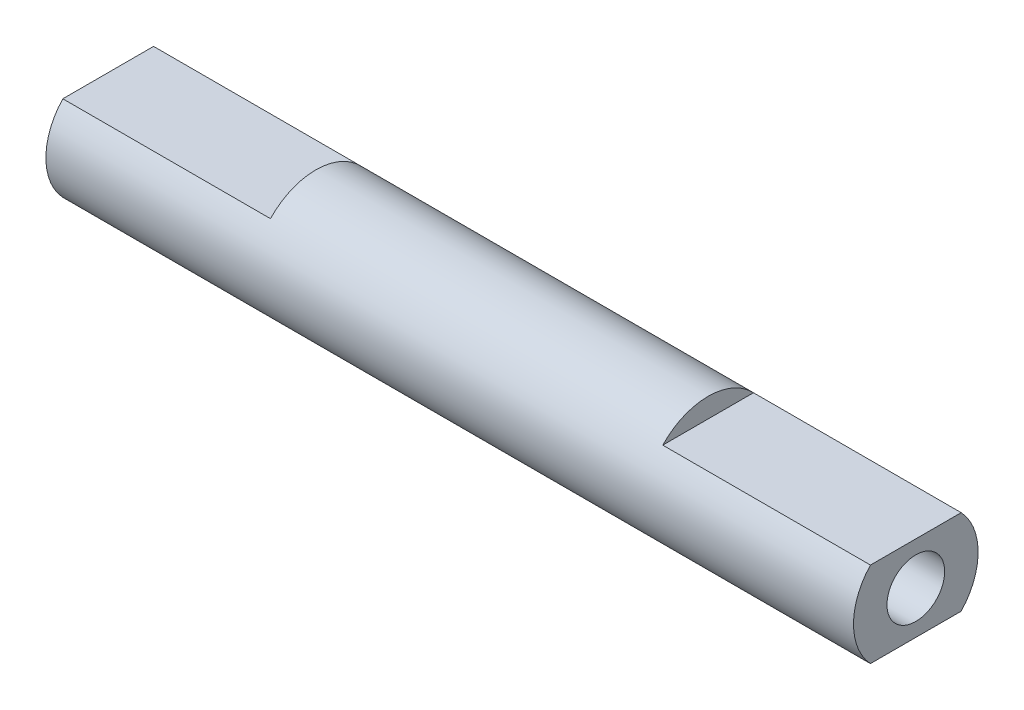
ISO-10303-21;
HEADER;
FILE_DESCRIPTION(('STEP AP214'),'2;1');
FILE_NAME('part.step','',(''),(''),'','','');
FILE_SCHEMA(('AUTOMOTIVE_DESIGN { 1 0 10303 214 1 1 1 1 }'));
ENDSEC;
DATA;
#1=APPLICATION_CONTEXT('core data for automotive mechanical design processes');
#2=APPLICATION_PROTOCOL_DEFINITION('international standard','automotive_design',2000,#1);
#3=PRODUCT_CONTEXT('',#1,'mechanical');
#4=PRODUCT('Part','Part','',(#3));
#5=PRODUCT_RELATED_PRODUCT_CATEGORY('part','',(#4));
#6=PRODUCT_DEFINITION_FORMATION('','',#4);
#7=PRODUCT_DEFINITION_CONTEXT('part definition',#1,'design');
#8=PRODUCT_DEFINITION('design','',#6,#7);
#9=PRODUCT_DEFINITION_SHAPE('','',#8);
#10=(LENGTH_UNIT() NAMED_UNIT(*) SI_UNIT(.MILLI.,.METRE.));
#11=(NAMED_UNIT(*) PLANE_ANGLE_UNIT() SI_UNIT($,.RADIAN.));
#12=(NAMED_UNIT(*) SI_UNIT($,.STERADIAN.) SOLID_ANGLE_UNIT());
#13=UNCERTAINTY_MEASURE_WITH_UNIT(LENGTH_MEASURE(1.E-05),#10,'distance_accuracy_value','');
#14=(GEOMETRIC_REPRESENTATION_CONTEXT(3) GLOBAL_UNCERTAINTY_ASSIGNED_CONTEXT((#13)) GLOBAL_UNIT_ASSIGNED_CONTEXT((#10,
#11,#12)) REPRESENTATION_CONTEXT('',''));
#15=CARTESIAN_POINT('',(0.,0.,0.));
#16=DIRECTION('',(0.,0.,1.));
#17=DIRECTION('',(1.,0.,0.));
#18=AXIS2_PLACEMENT_3D('',#15,#16,#17);
#19=CARTESIAN_POINT('',(35.,0.,0.));
#20=DIRECTION('',(-1.,0.,0.));
#21=DIRECTION('',(0.,0.,1.));
#22=AXIS2_PLACEMENT_3D('',#19,#20,#21);
#23=CYLINDRICAL_SURFACE('',#22,2.7);
#24=CARTESIAN_POINT('',(35.,0.,0.));
#25=DIRECTION('',(1.,0.,0.));
#26=DIRECTION('',(0.,0.,-1.));
#27=AXIS2_PLACEMENT_3D('',#24,#25,#26);
#28=CIRCLE('',#27,2.7);
#29=CARTESIAN_POINT('',(35.,-1.85,-1.96659604392971));
#30=VERTEX_POINT('',#29);
#31=CARTESIAN_POINT('',(35.,1.85,-1.96659604392971));
#32=VERTEX_POINT('',#31);
#33=EDGE_CURVE('E153',#30,#32,#28,.T.);
#34=ORIENTED_EDGE('',*,*,#33,.F.);
#35=DIRECTION('',(-1.,0.,0.));
#36=VECTOR('',#35,1.);
#37=CARTESIAN_POINT('',(35.,-1.85,-1.96659604392971));
#38=LINE('',#37,#36);
#39=CARTESIAN_POINT('',(26.,-1.85,-1.96659604392971));
#40=VERTEX_POINT('',#39);
#41=EDGE_CURVE('E54',#30,#40,#38,.T.);
#42=ORIENTED_EDGE('',*,*,#41,.T.);
#43=CARTESIAN_POINT('',(26.,0.,0.));
#44=DIRECTION('',(-1.,0.,0.));
#45=DIRECTION('',(0.,0.,1.));
#46=AXIS2_PLACEMENT_3D('',#43,#44,#45);
#47=CIRCLE('',#46,2.7);
#48=CARTESIAN_POINT('',(26.,-1.85,1.96659604392971));
#49=VERTEX_POINT('',#48);
#50=EDGE_CURVE('E173',#40,#49,#47,.T.);
#51=ORIENTED_EDGE('',*,*,#50,.T.);
#52=DIRECTION('',(-1.,0.,0.));
#53=VECTOR('',#52,1.);
#54=CARTESIAN_POINT('',(35.,-1.85,1.96659604392971));
#55=LINE('',#54,#53);
#56=CARTESIAN_POINT('',(35.,-1.85,1.96659604392971));
#57=VERTEX_POINT('',#56);
#58=EDGE_CURVE('E148',#49,#57,#55,.F.);
#59=ORIENTED_EDGE('',*,*,#58,.T.);
#60=CARTESIAN_POINT('',(35.,1.85,1.96659604392971));
#61=VERTEX_POINT('',#60);
#62=EDGE_CURVE('E156',#61,#57,#28,.T.);
#63=ORIENTED_EDGE('',*,*,#62,.F.);
#64=DIRECTION('',(-1.,0.,0.));
#65=VECTOR('',#64,1.);
#66=CARTESIAN_POINT('',(35.,1.85,1.96659604392971));
#67=LINE('',#66,#65);
#68=CARTESIAN_POINT('',(26.,1.85,1.96659604392971));
#69=VERTEX_POINT('',#68);
#70=EDGE_CURVE('E62',#61,#69,#67,.T.);
#71=ORIENTED_EDGE('',*,*,#70,.T.);
#72=CARTESIAN_POINT('',(26.,0.,0.));
#73=DIRECTION('',(-1.,0.,0.));
#74=DIRECTION('',(0.,0.,1.));
#75=AXIS2_PLACEMENT_3D('',#72,#73,#74);
#76=CIRCLE('',#75,2.7);
#77=CARTESIAN_POINT('',(26.,1.85,-1.96659604392971));
#78=VERTEX_POINT('',#77);
#79=EDGE_CURVE('E170',#69,#78,#76,.T.);
#80=ORIENTED_EDGE('',*,*,#79,.T.);
#81=DIRECTION('',(-1.,0.,0.));
#82=VECTOR('',#81,1.);
#83=CARTESIAN_POINT('',(35.,1.85,-1.96659604392971));
#84=LINE('',#83,#82);
#85=EDGE_CURVE('E144',#78,#32,#84,.F.);
#86=ORIENTED_EDGE('',*,*,#85,.T.);
#87=EDGE_LOOP('',(#34,#42,#51,#59,#63,#71,#80,#86));
#88=FACE_BOUND('',#87,.T.);
#89=CARTESIAN_POINT('',(9.,0.,0.));
#90=DIRECTION('',(1.,0.,0.));
#91=DIRECTION('',(0.,0.,-1.));
#92=AXIS2_PLACEMENT_3D('',#89,#90,#91);
#93=CIRCLE('',#92,2.7);
#94=CARTESIAN_POINT('',(9.,1.85,-1.96659604392971));
#95=VERTEX_POINT('',#94);
#96=CARTESIAN_POINT('',(9.,1.85,1.96659604392971));
#97=VERTEX_POINT('',#96);
#98=EDGE_CURVE('E11',#95,#97,#93,.T.);
#99=ORIENTED_EDGE('',*,*,#98,.T.);
#100=DIRECTION('',(-1.,0.,0.));
#101=VECTOR('',#100,1.);
#102=CARTESIAN_POINT('',(35.,1.85,1.96659604392971));
#103=LINE('',#102,#101);
#104=CARTESIAN_POINT('',(0.,1.85,1.96659604392971));
#105=VERTEX_POINT('',#104);
#106=EDGE_CURVE('E141',#97,#105,#103,.T.);
#107=ORIENTED_EDGE('',*,*,#106,.T.);
#108=CARTESIAN_POINT('',(0.,0.,0.));
#109=DIRECTION('',(1.,0.,0.));
#110=DIRECTION('',(0.,0.,-1.));
#111=AXIS2_PLACEMENT_3D('',#108,#109,#110);
#112=CIRCLE('',#111,2.7);
#113=CARTESIAN_POINT('',(0.,-1.85,1.96659604392971));
#114=VERTEX_POINT('',#113);
#115=EDGE_CURVE('E157',#105,#114,#112,.T.);
#116=ORIENTED_EDGE('',*,*,#115,.T.);
#117=DIRECTION('',(-1.,0.,0.));
#118=VECTOR('',#117,1.);
#119=CARTESIAN_POINT('',(35.,-1.85,1.96659604392971));
#120=LINE('',#119,#118);
#121=CARTESIAN_POINT('',(9.,-1.85,1.96659604392971));
#122=VERTEX_POINT('',#121);
#123=EDGE_CURVE('E132',#114,#122,#120,.F.);
#124=ORIENTED_EDGE('',*,*,#123,.T.);
#125=CARTESIAN_POINT('',(9.,0.,0.));
#126=DIRECTION('',(1.,0.,0.));
#127=DIRECTION('',(0.,0.,-1.));
#128=AXIS2_PLACEMENT_3D('',#125,#126,#127);
#129=CIRCLE('',#128,2.7);
#130=CARTESIAN_POINT('',(9.,-1.85,-1.96659604392971));
#131=VERTEX_POINT('',#130);
#132=EDGE_CURVE('E47',#122,#131,#129,.T.);
#133=ORIENTED_EDGE('',*,*,#132,.T.);
#134=DIRECTION('',(-1.,0.,0.));
#135=VECTOR('',#134,1.);
#136=CARTESIAN_POINT('',(35.,-1.85,-1.96659604392971));
#137=LINE('',#136,#135);
#138=CARTESIAN_POINT('',(0.,-1.85,-1.96659604392971));
#139=VERTEX_POINT('',#138);
#140=EDGE_CURVE('E135',#131,#139,#137,.T.);
#141=ORIENTED_EDGE('',*,*,#140,.T.);
#142=CARTESIAN_POINT('',(0.,1.85,-1.96659604392971));
#143=VERTEX_POINT('',#142);
#144=EDGE_CURVE('E152',#139,#143,#112,.T.);
#145=ORIENTED_EDGE('',*,*,#144,.T.);
#146=DIRECTION('',(-1.,0.,0.));
#147=VECTOR('',#146,1.);
#148=CARTESIAN_POINT('',(35.,1.85,-1.96659604392971));
#149=LINE('',#148,#147);
#150=EDGE_CURVE('E138',#143,#95,#149,.F.);
#151=ORIENTED_EDGE('',*,*,#150,.T.);
#152=EDGE_LOOP('',(#99,#107,#116,#124,#133,#141,#145,#151));
#153=FACE_BOUND('',#152,.T.);
#154=ADVANCED_FACE('F40',(#88,#153),#23,.T.);
#155=CARTESIAN_POINT('',(35.,0.,0.));
#156=DIRECTION('',(1.,0.,0.));
#157=DIRECTION('',(0.,0.,-1.));
#158=AXIS2_PLACEMENT_3D('',#155,#156,#157);
#159=PLANE('',#158);
#160=CARTESIAN_POINT('',(35.,0.,0.));
#161=DIRECTION('',(1.,0.,0.));
#162=DIRECTION('',(0.,0.,-1.));
#163=AXIS2_PLACEMENT_3D('',#160,#161,#162);
#164=CIRCLE('',#163,1.25);
#165=CARTESIAN_POINT('',(35.,0.,-1.25));
#166=VERTEX_POINT('',#165);
#167=EDGE_CURVE('E117',#166,#166,#164,.T.);
#168=ORIENTED_EDGE('',*,*,#167,.F.);
#169=EDGE_LOOP('',(#168));
#170=FACE_BOUND('',#169,.T.);
#171=DIRECTION('',(0.,0.,1.));
#172=VECTOR('',#171,1.);
#173=CARTESIAN_POINT('',(35.,-1.85,0.));
#174=LINE('',#173,#172);
#175=EDGE_CURVE('E168',#30,#57,#174,.T.);
#176=ORIENTED_EDGE('',*,*,#175,.F.);
#177=ORIENTED_EDGE('',*,*,#33,.T.);
#178=DIRECTION('',(0.,0.,-1.));
#179=VECTOR('',#178,1.);
#180=CARTESIAN_POINT('',(35.,1.85,0.));
#181=LINE('',#180,#179);
#182=EDGE_CURVE('E166',#61,#32,#181,.T.);
#183=ORIENTED_EDGE('',*,*,#182,.F.);
#184=ORIENTED_EDGE('',*,*,#62,.T.);
#185=EDGE_LOOP('',(#176,#177,#183,#184));
#186=FACE_BOUND('',#185,.T.);
#187=ADVANCED_FACE('F204',(#170,#186),#159,.T.);
#188=CARTESIAN_POINT('',(0.,0.,0.));
#189=DIRECTION('',(1.,0.,0.));
#190=DIRECTION('',(0.,0.,-1.));
#191=AXIS2_PLACEMENT_3D('',#188,#189,#190);
#192=PLANE('',#191);
#193=ORIENTED_EDGE('',*,*,#115,.F.);
#194=DIRECTION('',(0.,0.,-1.));
#195=VECTOR('',#194,1.);
#196=CARTESIAN_POINT('',(0.,1.85,0.));
#197=LINE('',#196,#195);
#198=EDGE_CURVE('E163',#105,#143,#197,.T.);
#199=ORIENTED_EDGE('',*,*,#198,.T.);
#200=ORIENTED_EDGE('',*,*,#144,.F.);
#201=DIRECTION('',(0.,0.,1.));
#202=VECTOR('',#201,1.);
#203=CARTESIAN_POINT('',(0.,-1.85,0.));
#204=LINE('',#203,#202);
#205=EDGE_CURVE('E160',#139,#114,#204,.T.);
#206=ORIENTED_EDGE('',*,*,#205,.T.);
#207=EDGE_LOOP('',(#193,#199,#200,#206));
#208=FACE_BOUND('',#207,.T.);
#209=ADVANCED_FACE('F186',(#208),#192,.F.);
#210=CARTESIAN_POINT('',(9.,-2.7,-2.7));
#211=DIRECTION('',(1.,0.,0.));
#212=DIRECTION('',(0.,0.,-1.));
#213=AXIS2_PLACEMENT_3D('',#210,#211,#212);
#214=PLANE('',#213);
#215=DIRECTION('',(0.,0.,1.));
#216=VECTOR('',#215,1.);
#217=CARTESIAN_POINT('',(9.,-1.85,-2.7));
#218=LINE('',#217,#216);
#219=EDGE_CURVE('E120',#131,#122,#218,.T.);
#220=ORIENTED_EDGE('',*,*,#219,.F.);
#221=ORIENTED_EDGE('',*,*,#132,.F.);
#222=EDGE_LOOP('',(#220,#221));
#223=FACE_BOUND('',#222,.T.);
#224=ADVANCED_FACE('F181',(#223),#214,.F.);
#225=CARTESIAN_POINT('',(0.,-1.85,-2.7));
#226=DIRECTION('',(0.,1.,0.));
#227=DIRECTION('',(0.,0.,1.));
#228=AXIS2_PLACEMENT_3D('',#225,#226,#227);
#229=PLANE('',#228);
#230=ORIENTED_EDGE('',*,*,#219,.T.);
#231=ORIENTED_EDGE('',*,*,#123,.F.);
#232=ORIENTED_EDGE('',*,*,#205,.F.);
#233=ORIENTED_EDGE('',*,*,#140,.F.);
#234=EDGE_LOOP('',(#230,#231,#232,#233));
#235=FACE_BOUND('',#234,.T.);
#236=ADVANCED_FACE('F183',(#235),#229,.F.);
#237=CARTESIAN_POINT('',(9.,2.7,-2.7));
#238=DIRECTION('',(1.,0.,0.));
#239=DIRECTION('',(0.,0.,-1.));
#240=AXIS2_PLACEMENT_3D('',#237,#238,#239);
#241=PLANE('',#240);
#242=DIRECTION('',(0.,0.,1.));
#243=VECTOR('',#242,1.);
#244=CARTESIAN_POINT('',(9.,1.85,-2.7));
#245=LINE('',#244,#243);
#246=EDGE_CURVE('E116',#95,#97,#245,.T.);
#247=ORIENTED_EDGE('',*,*,#246,.T.);
#248=ORIENTED_EDGE('',*,*,#98,.F.);
#249=EDGE_LOOP('',(#247,#248));
#250=FACE_BOUND('',#249,.T.);
#251=ADVANCED_FACE('F192',(#250),#241,.F.);
#252=CARTESIAN_POINT('',(0.,1.85,-2.7));
#253=DIRECTION('',(0.,-1.,0.));
#254=DIRECTION('',(0.,0.,-1.));
#255=AXIS2_PLACEMENT_3D('',#252,#253,#254);
#256=PLANE('',#255);
#257=ORIENTED_EDGE('',*,*,#246,.F.);
#258=ORIENTED_EDGE('',*,*,#150,.F.);
#259=ORIENTED_EDGE('',*,*,#198,.F.);
#260=ORIENTED_EDGE('',*,*,#106,.F.);
#261=EDGE_LOOP('',(#257,#258,#259,#260));
#262=FACE_BOUND('',#261,.T.);
#263=ADVANCED_FACE('F190',(#262),#256,.F.);
#264=CARTESIAN_POINT('',(26.,2.7,-2.7));
#265=DIRECTION('',(-1.,0.,0.));
#266=DIRECTION('',(0.,0.,1.));
#267=AXIS2_PLACEMENT_3D('',#264,#265,#266);
#268=PLANE('',#267);
#269=DIRECTION('',(0.,0.,1.));
#270=VECTOR('',#269,1.);
#271=CARTESIAN_POINT('',(26.,1.85,-2.7));
#272=LINE('',#271,#270);
#273=EDGE_CURVE('E128',#78,#69,#272,.T.);
#274=ORIENTED_EDGE('',*,*,#273,.F.);
#275=ORIENTED_EDGE('',*,*,#79,.F.);
#276=EDGE_LOOP('',(#274,#275));
#277=FACE_BOUND('',#276,.T.);
#278=ADVANCED_FACE('F199',(#277),#268,.F.);
#279=CARTESIAN_POINT('',(35.,1.85,-2.7));
#280=DIRECTION('',(0.,-1.,0.));
#281=DIRECTION('',(0.,0.,-1.));
#282=AXIS2_PLACEMENT_3D('',#279,#280,#281);
#283=PLANE('',#282);
#284=ORIENTED_EDGE('',*,*,#182,.T.);
#285=ORIENTED_EDGE('',*,*,#85,.F.);
#286=ORIENTED_EDGE('',*,*,#273,.T.);
#287=ORIENTED_EDGE('',*,*,#70,.F.);
#288=EDGE_LOOP('',(#284,#285,#286,#287));
#289=FACE_BOUND('',#288,.T.);
#290=ADVANCED_FACE('F218',(#289),#283,.F.);
#291=CARTESIAN_POINT('',(26.,-2.7,-2.7));
#292=DIRECTION('',(-1.,0.,0.));
#293=DIRECTION('',(0.,0.,1.));
#294=AXIS2_PLACEMENT_3D('',#291,#292,#293);
#295=PLANE('',#294);
#296=DIRECTION('',(0.,0.,1.));
#297=VECTOR('',#296,1.);
#298=CARTESIAN_POINT('',(26.,-1.85,-2.7));
#299=LINE('',#298,#297);
#300=EDGE_CURVE('E125',#40,#49,#299,.T.);
#301=ORIENTED_EDGE('',*,*,#300,.T.);
#302=ORIENTED_EDGE('',*,*,#50,.F.);
#303=EDGE_LOOP('',(#301,#302));
#304=FACE_BOUND('',#303,.T.);
#305=ADVANCED_FACE('F216',(#304),#295,.F.);
#306=CARTESIAN_POINT('',(35.,-1.85,-2.7));
#307=DIRECTION('',(0.,1.,0.));
#308=DIRECTION('',(0.,0.,1.));
#309=AXIS2_PLACEMENT_3D('',#306,#307,#308);
#310=PLANE('',#309);
#311=ORIENTED_EDGE('',*,*,#175,.T.);
#312=ORIENTED_EDGE('',*,*,#58,.F.);
#313=ORIENTED_EDGE('',*,*,#300,.F.);
#314=ORIENTED_EDGE('',*,*,#41,.F.);
#315=EDGE_LOOP('',(#311,#312,#313,#314));
#316=FACE_BOUND('',#315,.T.);
#317=ADVANCED_FACE('F110',(#316),#310,.F.);
#318=CARTESIAN_POINT('',(27.5,0.,0.));
#319=DIRECTION('',(1.,0.,0.));
#320=DIRECTION('',(0.,0.,-1.));
#321=AXIS2_PLACEMENT_3D('',#318,#319,#320);
#322=CONICAL_SURFACE('',#321,1.25,1.02974425867665);
#323=CARTESIAN_POINT('',(26.7489242262156,0.,0.));
#324=VERTEX_POINT('',#323);
#325=VERTEX_LOOP('',#324);
#326=FACE_BOUND('',#325,.T.);
#327=CARTESIAN_POINT('',(27.5,0.,0.));
#328=DIRECTION('',(1.,0.,0.));
#329=DIRECTION('',(0.,0.,-1.));
#330=AXIS2_PLACEMENT_3D('',#327,#328,#329);
#331=CIRCLE('',#330,1.25);
#332=CARTESIAN_POINT('',(27.5,0.,-1.25));
#333=VERTEX_POINT('',#332);
#334=EDGE_CURVE('E114',#333,#333,#331,.T.);
#335=ORIENTED_EDGE('',*,*,#334,.T.);
#336=EDGE_LOOP('',(#335));
#337=FACE_BOUND('',#336,.T.);
#338=ADVANCED_FACE('F106',(#326,#337),#322,.F.);
#339=CARTESIAN_POINT('',(35.,0.,0.));
#340=DIRECTION('',(1.,0.,0.));
#341=DIRECTION('',(0.,0.,-1.));
#342=AXIS2_PLACEMENT_3D('',#339,#340,#341);
#343=CYLINDRICAL_SURFACE('',#342,1.25);
#344=ORIENTED_EDGE('',*,*,#334,.F.);
#345=EDGE_LOOP('',(#344));
#346=FACE_BOUND('',#345,.T.);
#347=ORIENTED_EDGE('',*,*,#167,.T.);
#348=EDGE_LOOP('',(#347));
#349=FACE_BOUND('',#348,.T.);
#350=ADVANCED_FACE('F109',(#346,#349),#343,.F.);
#351=CLOSED_SHELL('',(#154,#187,#209,#224,#236,#251,#263,#278,#290,#305,#317,#338,#350));
#352=MANIFOLD_SOLID_BREP('B2',#351);
#353=ADVANCED_BREP_SHAPE_REPRESENTATION('',(#18,#352),#14);
#354=SHAPE_DEFINITION_REPRESENTATION(#9,#353);
ENDSEC;
END-ISO-10303-21;
